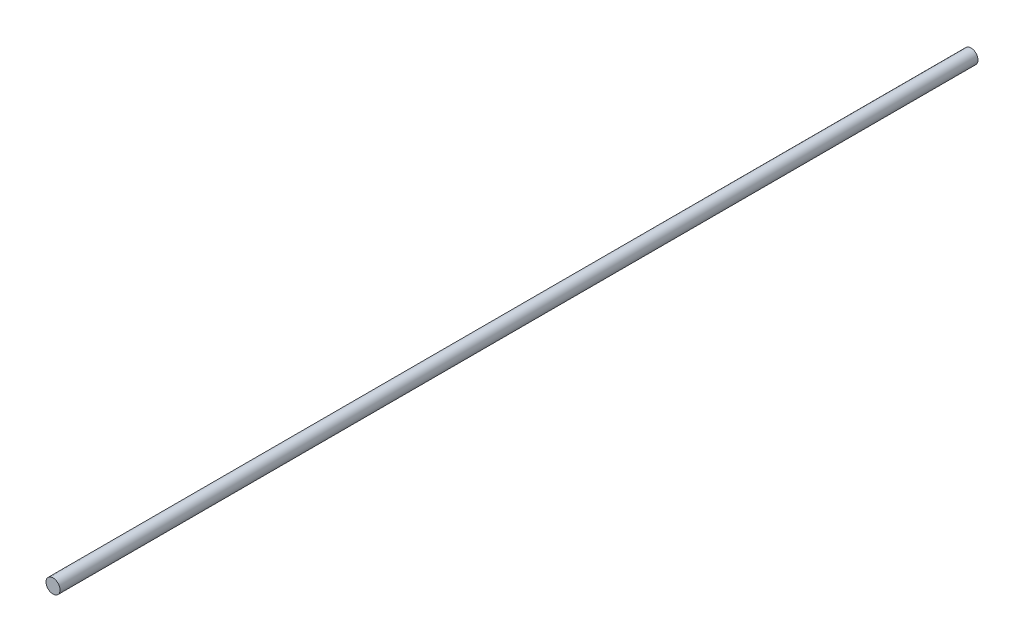
ISO-10303-21;
HEADER;
FILE_DESCRIPTION(('STEP AP214'),'2;1');
FILE_NAME('part.step','',(''),(''),'','','');
FILE_SCHEMA(('AUTOMOTIVE_DESIGN { 1 0 10303 214 1 1 1 1 }'));
ENDSEC;
DATA;
#1=APPLICATION_CONTEXT('core data for automotive mechanical design processes');
#2=APPLICATION_PROTOCOL_DEFINITION('international standard','automotive_design',2000,#1);
#3=PRODUCT_CONTEXT('',#1,'mechanical');
#4=PRODUCT('Part','Part','',(#3));
#5=PRODUCT_RELATED_PRODUCT_CATEGORY('part','',(#4));
#6=PRODUCT_DEFINITION_FORMATION('','',#4);
#7=PRODUCT_DEFINITION_CONTEXT('part definition',#1,'design');
#8=PRODUCT_DEFINITION('design','',#6,#7);
#9=PRODUCT_DEFINITION_SHAPE('','',#8);
#10=(LENGTH_UNIT() NAMED_UNIT(*) SI_UNIT(.MILLI.,.METRE.));
#11=(NAMED_UNIT(*) PLANE_ANGLE_UNIT() SI_UNIT($,.RADIAN.));
#12=(NAMED_UNIT(*) SI_UNIT($,.STERADIAN.) SOLID_ANGLE_UNIT());
#13=UNCERTAINTY_MEASURE_WITH_UNIT(LENGTH_MEASURE(1.E-05),#10,'distance_accuracy_value','');
#14=(GEOMETRIC_REPRESENTATION_CONTEXT(3) GLOBAL_UNCERTAINTY_ASSIGNED_CONTEXT((#13)) GLOBAL_UNIT_ASSIGNED_CONTEXT((#10,
#11,#12)) REPRESENTATION_CONTEXT('',''));
#15=CARTESIAN_POINT('',(0.,0.,0.));
#16=DIRECTION('',(0.,0.,1.));
#17=DIRECTION('',(1.,0.,0.));
#18=AXIS2_PLACEMENT_3D('',#15,#16,#17);
#19=CARTESIAN_POINT('',(0.,0.,327.));
#20=DIRECTION('',(0.,0.,-1.));
#21=DIRECTION('',(-1.,0.,0.));
#22=AXIS2_PLACEMENT_3D('',#19,#20,#21);
#23=CYLINDRICAL_SURFACE('',#22,2.5);
#24=CARTESIAN_POINT('',(0.,0.,327.));
#25=DIRECTION('',(0.,0.,1.));
#26=DIRECTION('',(1.,0.,0.));
#27=AXIS2_PLACEMENT_3D('',#24,#25,#26);
#28=CIRCLE('',#27,2.5);
#29=CARTESIAN_POINT('',(2.5,0.,327.));
#30=VERTEX_POINT('',#29);
#31=EDGE_CURVE('E10',#30,#30,#28,.T.);
#32=ORIENTED_EDGE('',*,*,#31,.F.);
#33=EDGE_LOOP('',(#32));
#34=FACE_BOUND('',#33,.T.);
#35=CARTESIAN_POINT('',(0.,0.,0.));
#36=DIRECTION('',(0.,0.,1.));
#37=DIRECTION('',(1.,0.,0.));
#38=AXIS2_PLACEMENT_3D('',#35,#36,#37);
#39=CIRCLE('',#38,2.5);
#40=CARTESIAN_POINT('',(2.5,0.,0.));
#41=VERTEX_POINT('',#40);
#42=EDGE_CURVE('E35',#41,#41,#39,.T.);
#43=ORIENTED_EDGE('',*,*,#42,.T.);
#44=EDGE_LOOP('',(#43));
#45=FACE_BOUND('',#44,.T.);
#46=ADVANCED_FACE('F32',(#34,#45),#23,.T.);
#47=CARTESIAN_POINT('',(0.,0.,327.));
#48=DIRECTION('',(0.,0.,1.));
#49=DIRECTION('',(1.,0.,0.));
#50=AXIS2_PLACEMENT_3D('',#47,#48,#49);
#51=PLANE('',#50);
#52=ORIENTED_EDGE('',*,*,#31,.T.);
#53=EDGE_LOOP('',(#52));
#54=FACE_BOUND('',#53,.T.);
#55=ADVANCED_FACE('F47',(#54),#51,.T.);
#56=CARTESIAN_POINT('',(0.,0.,0.));
#57=DIRECTION('',(0.,0.,1.));
#58=DIRECTION('',(1.,0.,0.));
#59=AXIS2_PLACEMENT_3D('',#56,#57,#58);
#60=PLANE('',#59);
#61=ORIENTED_EDGE('',*,*,#42,.F.);
#62=EDGE_LOOP('',(#61));
#63=FACE_BOUND('',#62,.T.);
#64=ADVANCED_FACE('F45',(#63),#60,.F.);
#65=CLOSED_SHELL('',(#46,#55,#64));
#66=MANIFOLD_SOLID_BREP('B2',#65);
#67=ADVANCED_BREP_SHAPE_REPRESENTATION('',(#18,#66),#14);
#68=SHAPE_DEFINITION_REPRESENTATION(#9,#67);
ENDSEC;
END-ISO-10303-21;
